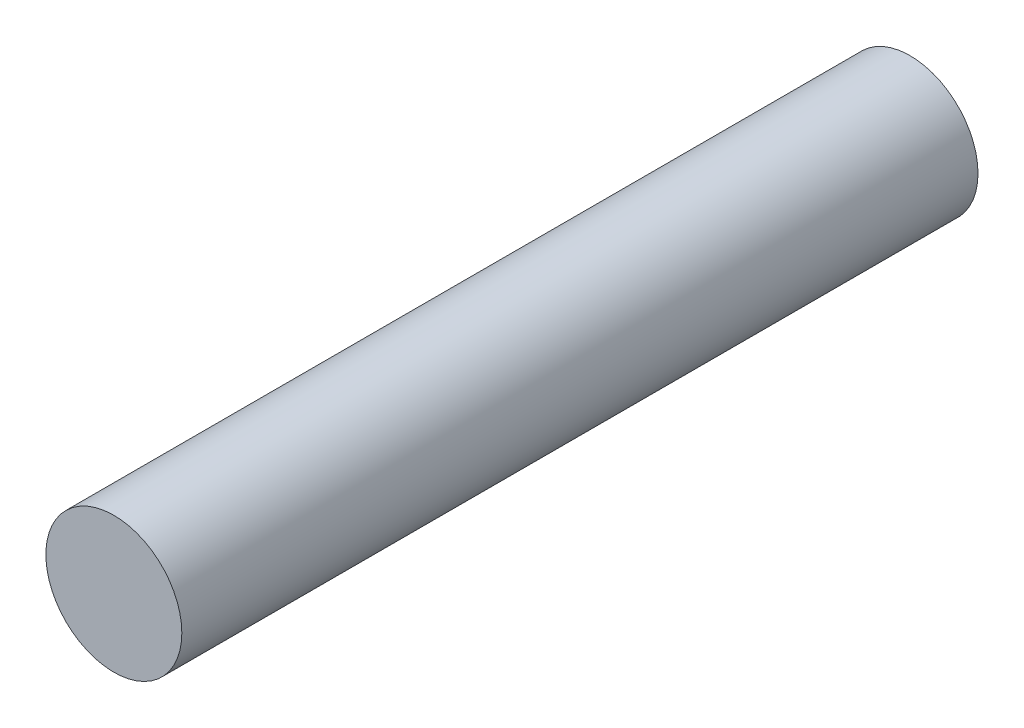
ISO-10303-21;
HEADER;
FILE_DESCRIPTION(('STEP AP214'),'2;1');
FILE_NAME('part.step','',(''),(''),'','','');
FILE_SCHEMA(('AUTOMOTIVE_DESIGN { 1 0 10303 214 1 1 1 1 }'));
ENDSEC;
DATA;
#1=APPLICATION_CONTEXT('core data for automotive mechanical design processes');
#2=APPLICATION_PROTOCOL_DEFINITION('international standard','automotive_design',2000,#1);
#3=PRODUCT_CONTEXT('',#1,'mechanical');
#4=PRODUCT('Part','Part','',(#3));
#5=PRODUCT_RELATED_PRODUCT_CATEGORY('part','',(#4));
#6=PRODUCT_DEFINITION_FORMATION('','',#4);
#7=PRODUCT_DEFINITION_CONTEXT('part definition',#1,'design');
#8=PRODUCT_DEFINITION('design','',#6,#7);
#9=PRODUCT_DEFINITION_SHAPE('','',#8);
#10=(LENGTH_UNIT() NAMED_UNIT(*) SI_UNIT(.MILLI.,.METRE.));
#11=(NAMED_UNIT(*) PLANE_ANGLE_UNIT() SI_UNIT($,.RADIAN.));
#12=(NAMED_UNIT(*) SI_UNIT($,.STERADIAN.) SOLID_ANGLE_UNIT());
#13=UNCERTAINTY_MEASURE_WITH_UNIT(LENGTH_MEASURE(1.E-05),#10,'distance_accuracy_value','');
#14=(GEOMETRIC_REPRESENTATION_CONTEXT(3) GLOBAL_UNCERTAINTY_ASSIGNED_CONTEXT((#13)) GLOBAL_UNIT_ASSIGNED_CONTEXT((#10,
#11,#12)) REPRESENTATION_CONTEXT('',''));
#15=CARTESIAN_POINT('',(0.,0.,0.));
#16=DIRECTION('',(0.,0.,1.));
#17=DIRECTION('',(1.,0.,0.));
#18=AXIS2_PLACEMENT_3D('',#15,#16,#17);
#19=CARTESIAN_POINT('',(0.,0.,65.));
#20=DIRECTION('',(0.,0.,-1.));
#21=DIRECTION('',(-1.,0.,0.));
#22=AXIS2_PLACEMENT_3D('',#19,#20,#21);
#23=CYLINDRICAL_SURFACE('',#22,11.1);
#24=CARTESIAN_POINT('',(0.,0.,65.));
#25=DIRECTION('',(0.,0.,1.));
#26=DIRECTION('',(1.,0.,0.));
#27=AXIS2_PLACEMENT_3D('',#24,#25,#26);
#28=CIRCLE('',#27,11.1);
#29=CARTESIAN_POINT('',(11.1,0.,65.));
#30=VERTEX_POINT('',#29);
#31=EDGE_CURVE('E10',#30,#30,#28,.T.);
#32=ORIENTED_EDGE('',*,*,#31,.F.);
#33=EDGE_LOOP('',(#32));
#34=FACE_BOUND('',#33,.T.);
#35=CARTESIAN_POINT('',(0.,0.,-65.));
#36=DIRECTION('',(0.,0.,1.));
#37=DIRECTION('',(1.,0.,0.));
#38=AXIS2_PLACEMENT_3D('',#35,#36,#37);
#39=CIRCLE('',#38,11.1);
#40=CARTESIAN_POINT('',(11.1,0.,-65.));
#41=VERTEX_POINT('',#40);
#42=EDGE_CURVE('E31',#41,#41,#39,.T.);
#43=ORIENTED_EDGE('',*,*,#42,.T.);
#44=EDGE_LOOP('',(#43));
#45=FACE_BOUND('',#44,.T.);
#46=ADVANCED_FACE('F28',(#34,#45),#23,.T.);
#47=CARTESIAN_POINT('',(0.,0.,65.));
#48=DIRECTION('',(0.,0.,1.));
#49=DIRECTION('',(1.,0.,0.));
#50=AXIS2_PLACEMENT_3D('',#47,#48,#49);
#51=PLANE('',#50);
#52=ORIENTED_EDGE('',*,*,#31,.T.);
#53=EDGE_LOOP('',(#52));
#54=FACE_BOUND('',#53,.T.);
#55=ADVANCED_FACE('F43',(#54),#51,.T.);
#56=CARTESIAN_POINT('',(0.,0.,-65.));
#57=DIRECTION('',(0.,0.,1.));
#58=DIRECTION('',(1.,0.,0.));
#59=AXIS2_PLACEMENT_3D('',#56,#57,#58);
#60=PLANE('',#59);
#61=ORIENTED_EDGE('',*,*,#42,.F.);
#62=EDGE_LOOP('',(#61));
#63=FACE_BOUND('',#62,.T.);
#64=ADVANCED_FACE('F41',(#63),#60,.F.);
#65=CLOSED_SHELL('',(#46,#55,#64));
#66=MANIFOLD_SOLID_BREP('B2',#65);
#67=ADVANCED_BREP_SHAPE_REPRESENTATION('',(#18,#66),#14);
#68=SHAPE_DEFINITION_REPRESENTATION(#9,#67);
ENDSEC;
END-ISO-10303-21;
